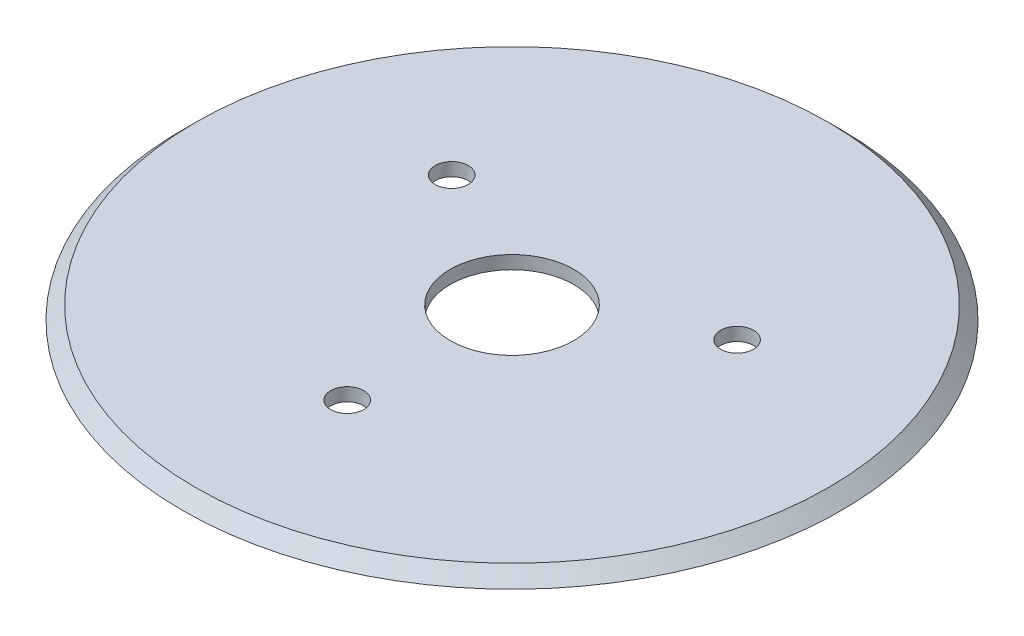
ISO-10303-21;
HEADER;
FILE_DESCRIPTION(('STEP AP214'),'2;1');
FILE_NAME('part.step','',(''),(''),'','','');
FILE_SCHEMA(('AUTOMOTIVE_DESIGN { 1 0 10303 214 1 1 1 1 }'));
ENDSEC;
DATA;
#1=APPLICATION_CONTEXT('core data for automotive mechanical design processes');
#2=APPLICATION_PROTOCOL_DEFINITION('international standard','automotive_design',2000,#1);
#3=PRODUCT_CONTEXT('',#1,'mechanical');
#4=PRODUCT('Part','Part','',(#3));
#5=PRODUCT_RELATED_PRODUCT_CATEGORY('part','',(#4));
#6=PRODUCT_DEFINITION_FORMATION('','',#4);
#7=PRODUCT_DEFINITION_CONTEXT('part definition',#1,'design');
#8=PRODUCT_DEFINITION('design','',#6,#7);
#9=PRODUCT_DEFINITION_SHAPE('','',#8);
#10=(LENGTH_UNIT() NAMED_UNIT(*) SI_UNIT(.MILLI.,.METRE.));
#11=(NAMED_UNIT(*) PLANE_ANGLE_UNIT() SI_UNIT($,.RADIAN.));
#12=(NAMED_UNIT(*) SI_UNIT($,.STERADIAN.) SOLID_ANGLE_UNIT());
#13=UNCERTAINTY_MEASURE_WITH_UNIT(LENGTH_MEASURE(1.E-05),#10,'distance_accuracy_value','');
#14=(GEOMETRIC_REPRESENTATION_CONTEXT(3) GLOBAL_UNCERTAINTY_ASSIGNED_CONTEXT((#13)) GLOBAL_UNIT_ASSIGNED_CONTEXT((#10,
#11,#12)) REPRESENTATION_CONTEXT('',''));
#15=CARTESIAN_POINT('',(0.,0.,0.));
#16=DIRECTION('',(0.,0.,1.));
#17=DIRECTION('',(1.,0.,0.));
#18=AXIS2_PLACEMENT_3D('',#15,#16,#17);
#19=CARTESIAN_POINT('',(0.,1.6,0.));
#20=DIRECTION('',(0.,1.,0.));
#21=DIRECTION('',(0.,0.,1.));
#22=AXIS2_PLACEMENT_3D('',#19,#20,#21);
#23=PLANE('',#22);
#24=CARTESIAN_POINT('',(0.,1.6,0.));
#25=DIRECTION('',(0.,1.,0.));
#26=DIRECTION('',(0.,0.,1.));
#27=AXIS2_PLACEMENT_3D('',#24,#25,#26);
#28=CIRCLE('',#27,38.4);
#29=CARTESIAN_POINT('',(0.,1.6,38.4));
#30=VERTEX_POINT('',#29);
#31=EDGE_CURVE('E10',#30,#30,#28,.T.);
#32=ORIENTED_EDGE('',*,*,#31,.T.);
#33=EDGE_LOOP('',(#32));
#34=FACE_BOUND('',#33,.T.);
#35=CARTESIAN_POINT('',(0.,1.6,20.));
#36=DIRECTION('',(0.,1.,0.));
#37=DIRECTION('',(0.,0.,1.));
#38=AXIS2_PLACEMENT_3D('',#35,#36,#37);
#39=CIRCLE('',#38,2.);
#40=CARTESIAN_POINT('',(0.,1.6,22.));
#41=VERTEX_POINT('',#40);
#42=EDGE_CURVE('E52',#41,#41,#39,.T.);
#43=ORIENTED_EDGE('',*,*,#42,.F.);
#44=EDGE_LOOP('',(#43));
#45=FACE_BOUND('',#44,.T.);
#46=CARTESIAN_POINT('',(-17.3205080756872,1.6,-10.0000000000009));
#47=DIRECTION('',(0.,1.,0.));
#48=DIRECTION('',(0.,0.,1.));
#49=AXIS2_PLACEMENT_3D('',#46,#47,#48);
#50=CIRCLE('',#49,2.);
#51=CARTESIAN_POINT('',(-17.3205080756872,1.6,-8.00000000000091));
#52=VERTEX_POINT('',#51);
#53=EDGE_CURVE('E60',#52,#52,#50,.T.);
#54=ORIENTED_EDGE('',*,*,#53,.F.);
#55=EDGE_LOOP('',(#54));
#56=FACE_BOUND('',#55,.T.);
#57=CARTESIAN_POINT('',(17.3205080756904,1.6,-9.9999999999991));
#58=DIRECTION('',(0.,1.,0.));
#59=DIRECTION('',(0.,0.,1.));
#60=AXIS2_PLACEMENT_3D('',#57,#58,#59);
#61=CIRCLE('',#60,2.);
#62=CARTESIAN_POINT('',(17.3205080756904,1.6,-7.99999999999909));
#63=VERTEX_POINT('',#62);
#64=EDGE_CURVE('E53',#63,#63,#61,.T.);
#65=ORIENTED_EDGE('',*,*,#64,.F.);
#66=EDGE_LOOP('',(#65));
#67=FACE_BOUND('',#66,.T.);
#68=CARTESIAN_POINT('',(0.,1.6,0.));
#69=DIRECTION('',(0.,1.,0.));
#70=DIRECTION('',(0.,0.,1.));
#71=AXIS2_PLACEMENT_3D('',#68,#69,#70);
#72=CIRCLE('',#71,7.5);
#73=CARTESIAN_POINT('',(0.,1.6,7.5));
#74=VERTEX_POINT('',#73);
#75=EDGE_CURVE('E43',#74,#74,#72,.T.);
#76=ORIENTED_EDGE('',*,*,#75,.F.);
#77=EDGE_LOOP('',(#76));
#78=FACE_BOUND('',#77,.T.);
#79=ADVANCED_FACE('F32',(#34,#45,#56,#67,#78),#23,.T.);
#80=CARTESIAN_POINT('',(0.,0.,0.));
#81=DIRECTION('',(0.,1.,0.));
#82=DIRECTION('',(0.,0.,1.));
#83=AXIS2_PLACEMENT_3D('',#80,#81,#82);
#84=PLANE('',#83);
#85=CARTESIAN_POINT('',(0.,0.,20.));
#86=DIRECTION('',(0.,1.,0.));
#87=DIRECTION('',(0.,0.,1.));
#88=AXIS2_PLACEMENT_3D('',#85,#86,#87);
#89=CIRCLE('',#88,2.);
#90=CARTESIAN_POINT('',(0.,0.,22.));
#91=VERTEX_POINT('',#90);
#92=EDGE_CURVE('E63',#91,#91,#89,.T.);
#93=ORIENTED_EDGE('',*,*,#92,.T.);
#94=EDGE_LOOP('',(#93));
#95=FACE_BOUND('',#94,.T.);
#96=CARTESIAN_POINT('',(-17.3205080756872,0.,-10.0000000000009));
#97=DIRECTION('',(0.,1.,0.));
#98=DIRECTION('',(0.,0.,1.));
#99=AXIS2_PLACEMENT_3D('',#96,#97,#98);
#100=CIRCLE('',#99,2.);
#101=CARTESIAN_POINT('',(-17.3205080756872,0.,-8.00000000000091));
#102=VERTEX_POINT('',#101);
#103=EDGE_CURVE('E56',#102,#102,#100,.T.);
#104=ORIENTED_EDGE('',*,*,#103,.T.);
#105=EDGE_LOOP('',(#104));
#106=FACE_BOUND('',#105,.T.);
#107=CARTESIAN_POINT('',(17.3205080756904,0.,-9.9999999999991));
#108=DIRECTION('',(0.,1.,0.));
#109=DIRECTION('',(0.,0.,1.));
#110=AXIS2_PLACEMENT_3D('',#107,#108,#109);
#111=CIRCLE('',#110,2.);
#112=CARTESIAN_POINT('',(17.3205080756904,0.,-7.99999999999909));
#113=VERTEX_POINT('',#112);
#114=EDGE_CURVE('E57',#113,#113,#111,.T.);
#115=ORIENTED_EDGE('',*,*,#114,.T.);
#116=EDGE_LOOP('',(#115));
#117=FACE_BOUND('',#116,.T.);
#118=CARTESIAN_POINT('',(0.,0.,0.));
#119=DIRECTION('',(0.,1.,0.));
#120=DIRECTION('',(0.,0.,1.));
#121=AXIS2_PLACEMENT_3D('',#118,#119,#120);
#122=CIRCLE('',#121,7.5);
#123=CARTESIAN_POINT('',(0.,0.,7.5));
#124=VERTEX_POINT('',#123);
#125=EDGE_CURVE('E47',#124,#124,#122,.T.);
#126=ORIENTED_EDGE('',*,*,#125,.T.);
#127=EDGE_LOOP('',(#126));
#128=FACE_BOUND('',#127,.T.);
#129=CARTESIAN_POINT('',(0.,0.,0.));
#130=DIRECTION('',(0.,1.,0.));
#131=DIRECTION('',(0.,0.,1.));
#132=AXIS2_PLACEMENT_3D('',#129,#130,#131);
#133=CIRCLE('',#132,40.);
#134=CARTESIAN_POINT('',(0.,0.,40.));
#135=VERTEX_POINT('',#134);
#136=EDGE_CURVE('E39',#135,#135,#133,.T.);
#137=ORIENTED_EDGE('',*,*,#136,.F.);
#138=EDGE_LOOP('',(#137));
#139=FACE_BOUND('',#138,.T.);
#140=ADVANCED_FACE('F71',(#95,#106,#117,#128,#139),#84,.F.);
#141=CARTESIAN_POINT('',(0.,22.8132034355964,0.));
#142=DIRECTION('',(0.,-1.,0.));
#143=DIRECTION('',(0.,0.,-1.));
#144=AXIS2_PLACEMENT_3D('',#141,#142,#143);
#145=CYLINDRICAL_SURFACE('',#144,7.5);
#146=ORIENTED_EDGE('',*,*,#125,.F.);
#147=EDGE_LOOP('',(#146));
#148=FACE_BOUND('',#147,.T.);
#149=ORIENTED_EDGE('',*,*,#75,.T.);
#150=EDGE_LOOP('',(#149));
#151=FACE_BOUND('',#150,.T.);
#152=ADVANCED_FACE('F90',(#148,#151),#145,.F.);
#153=CARTESIAN_POINT('',(17.3205080756904,7.25685424949239,-9.9999999999991));
#154=DIRECTION('',(0.,-1.,0.));
#155=DIRECTION('',(0.,0.,-1.));
#156=AXIS2_PLACEMENT_3D('',#153,#154,#155);
#157=CYLINDRICAL_SURFACE('',#156,2.);
#158=ORIENTED_EDGE('',*,*,#114,.F.);
#159=EDGE_LOOP('',(#158));
#160=FACE_BOUND('',#159,.T.);
#161=ORIENTED_EDGE('',*,*,#64,.T.);
#162=EDGE_LOOP('',(#161));
#163=FACE_BOUND('',#162,.T.);
#164=ADVANCED_FACE('F92',(#160,#163),#157,.F.);
#165=CARTESIAN_POINT('',(-17.3205080756872,7.25685424949239,-10.0000000000009));
#166=DIRECTION('',(0.,-1.,0.));
#167=DIRECTION('',(0.,0.,-1.));
#168=AXIS2_PLACEMENT_3D('',#165,#166,#167);
#169=CYLINDRICAL_SURFACE('',#168,2.);
#170=ORIENTED_EDGE('',*,*,#103,.F.);
#171=EDGE_LOOP('',(#170));
#172=FACE_BOUND('',#171,.T.);
#173=ORIENTED_EDGE('',*,*,#53,.T.);
#174=EDGE_LOOP('',(#173));
#175=FACE_BOUND('',#174,.T.);
#176=ADVANCED_FACE('F77',(#172,#175),#169,.F.);
#177=CARTESIAN_POINT('',(0.,7.25685424949239,20.));
#178=DIRECTION('',(0.,-1.,0.));
#179=DIRECTION('',(0.,0.,-1.));
#180=AXIS2_PLACEMENT_3D('',#177,#178,#179);
#181=CYLINDRICAL_SURFACE('',#180,2.);
#182=ORIENTED_EDGE('',*,*,#92,.F.);
#183=EDGE_LOOP('',(#182));
#184=FACE_BOUND('',#183,.T.);
#185=ORIENTED_EDGE('',*,*,#42,.T.);
#186=EDGE_LOOP('',(#185));
#187=FACE_BOUND('',#186,.T.);
#188=ADVANCED_FACE('F74',(#184,#187),#181,.F.);
#189=CARTESIAN_POINT('',(0.,1.6,0.));
#190=DIRECTION('',(0.,-1.,0.));
#191=DIRECTION('',(0.,0.,-1.));
#192=AXIS2_PLACEMENT_3D('',#189,#190,#191);
#193=CONICAL_SURFACE('',#192,38.4,0.785398163397446);
#194=ORIENTED_EDGE('',*,*,#136,.T.);
#195=EDGE_LOOP('',(#194));
#196=FACE_BOUND('',#195,.T.);
#197=ORIENTED_EDGE('',*,*,#31,.F.);
#198=EDGE_LOOP('',(#197));
#199=FACE_BOUND('',#198,.T.);
#200=ADVANCED_FACE('F34',(#196,#199),#193,.T.);
#201=CLOSED_SHELL('',(#79,#140,#152,#164,#176,#188,#200));
#202=MANIFOLD_SOLID_BREP('B2',#201);
#203=ADVANCED_BREP_SHAPE_REPRESENTATION('',(#18,#202),#14);
#204=SHAPE_DEFINITION_REPRESENTATION(#9,#203);
ENDSEC;
END-ISO-10303-21;
